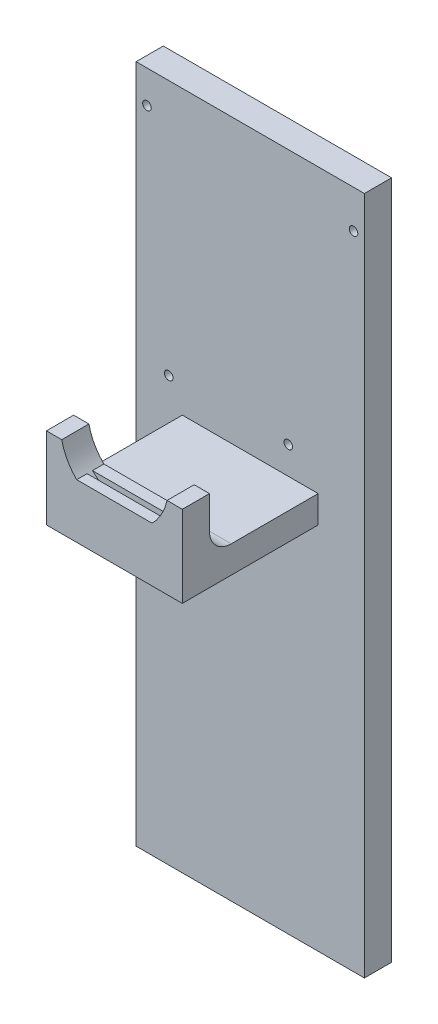
ISO-10303-21;
HEADER;
FILE_DESCRIPTION(('STEP AP214'),'2;1');
FILE_NAME('part.step','',(''),(''),'','','');
FILE_SCHEMA(('AUTOMOTIVE_DESIGN { 1 0 10303 214 1 1 1 1 }'));
ENDSEC;
DATA;
#1=APPLICATION_CONTEXT('core data for automotive mechanical design processes');
#2=APPLICATION_PROTOCOL_DEFINITION('international standard','automotive_design',2000,#1);
#3=PRODUCT_CONTEXT('',#1,'mechanical');
#4=PRODUCT('Part','Part','',(#3));
#5=PRODUCT_RELATED_PRODUCT_CATEGORY('part','',(#4));
#6=PRODUCT_DEFINITION_FORMATION('','',#4);
#7=PRODUCT_DEFINITION_CONTEXT('part definition',#1,'design');
#8=PRODUCT_DEFINITION('design','',#6,#7);
#9=PRODUCT_DEFINITION_SHAPE('','',#8);
#10=(LENGTH_UNIT() NAMED_UNIT(*) SI_UNIT(.MILLI.,.METRE.));
#11=(NAMED_UNIT(*) PLANE_ANGLE_UNIT() SI_UNIT($,.RADIAN.));
#12=(NAMED_UNIT(*) SI_UNIT($,.STERADIAN.) SOLID_ANGLE_UNIT());
#13=UNCERTAINTY_MEASURE_WITH_UNIT(LENGTH_MEASURE(1.E-05),#10,'distance_accuracy_value','');
#14=(GEOMETRIC_REPRESENTATION_CONTEXT(3) GLOBAL_UNCERTAINTY_ASSIGNED_CONTEXT((#13)) GLOBAL_UNIT_ASSIGNED_CONTEXT((#10,
#11,#12)) REPRESENTATION_CONTEXT('',''));
#15=CARTESIAN_POINT('',(0.,0.,0.));
#16=DIRECTION('',(0.,0.,1.));
#17=DIRECTION('',(1.,0.,0.));
#18=AXIS2_PLACEMENT_3D('',#15,#16,#17);
#19=CARTESIAN_POINT('',(0.,75.889063863778,0.));
#20=DIRECTION('',(0.,-1.,0.));
#21=DIRECTION('',(0.,0.,-1.));
#22=AXIS2_PLACEMENT_3D('',#19,#20,#21);
#23=PLANE('',#22);
#24=DIRECTION('',(-1.,0.,0.));
#25=VECTOR('',#24,1.);
#26=CARTESIAN_POINT('',(-32.9664457831326,75.889063863778,31.75));
#27=LINE('',#26,#25);
#28=CARTESIAN_POINT('',(-1.2164457831326,75.889063863778,31.75));
#29=VERTEX_POINT('',#28);
#30=CARTESIAN_POINT('',(-4.7947593866237,75.889063863778,31.75));
#31=VERTEX_POINT('',#30);
#32=EDGE_CURVE('E208',#29,#31,#27,.T.);
#33=ORIENTED_EDGE('',*,*,#32,.T.);
#34=DIRECTION('',(0.,0.,1.));
#35=VECTOR('',#34,1.);
#36=CARTESIAN_POINT('',(-4.7947593866237,75.889063863778,-0.001000000000001));
#37=LINE('',#36,#35);
#38=CARTESIAN_POINT('',(-4.7947593866237,75.889063863778,38.1));
#39=VERTEX_POINT('',#38);
#40=EDGE_CURVE('E376',#39,#31,#37,.F.);
#41=ORIENTED_EDGE('',*,*,#40,.F.);
#42=DIRECTION('',(1.,0.,0.));
#43=VECTOR('',#42,1.);
#44=CARTESIAN_POINT('',(-32.9664457831326,75.889063863778,38.1));
#45=LINE('',#44,#43);
#46=CARTESIAN_POINT('',(-1.2164457831326,75.889063863778,38.1));
#47=VERTEX_POINT('',#46);
#48=EDGE_CURVE('E360',#39,#47,#45,.T.);
#49=ORIENTED_EDGE('',*,*,#48,.T.);
#50=DIRECTION('',(0.,0.,-1.));
#51=VECTOR('',#50,1.);
#52=CARTESIAN_POINT('',(-1.2164457831326,75.889063863778,38.1));
#53=LINE('',#52,#51);
#54=EDGE_CURVE('E364',#47,#29,#53,.T.);
#55=ORIENTED_EDGE('',*,*,#54,.T.);
#56=EDGE_LOOP('',(#33,#41,#49,#55));
#57=FACE_BOUND('',#56,.T.);
#58=ADVANCED_FACE('F39',(#57),#23,.F.);
#59=CARTESIAN_POINT('',(-32.9664457831326,63.189063863778,38.1));
#60=DIRECTION('',(0.,-1.,0.));
#61=DIRECTION('',(0.,0.,-1.));
#62=AXIS2_PLACEMENT_3D('',#59,#60,#61);
#63=PLANE('',#62);
#64=DIRECTION('',(0.,0.,-1.));
#65=VECTOR('',#64,1.);
#66=CARTESIAN_POINT('',(-32.9664457831326,63.189063863778,38.1));
#67=LINE('',#66,#65);
#68=CARTESIAN_POINT('',(-32.9664457831326,63.189063863778,26.67));
#69=VERTEX_POINT('',#68);
#70=CARTESIAN_POINT('',(-32.9664457831326,63.189063863778,6.35));
#71=VERTEX_POINT('',#70);
#72=EDGE_CURVE('E229',#69,#71,#67,.T.);
#73=ORIENTED_EDGE('',*,*,#72,.F.);
#74=DIRECTION('',(-1.,0.,0.));
#75=VECTOR('',#74,1.);
#76=CARTESIAN_POINT('',(-1.2164457831326,63.189063863778,26.67));
#77=LINE('',#76,#75);
#78=CARTESIAN_POINT('',(-1.2164457831326,63.189063863778,26.67));
#79=VERTEX_POINT('',#78);
#80=EDGE_CURVE('E61',#69,#79,#77,.F.);
#81=ORIENTED_EDGE('',*,*,#80,.T.);
#82=DIRECTION('',(0.,0.,-1.));
#83=VECTOR('',#82,1.);
#84=CARTESIAN_POINT('',(-1.2164457831326,63.189063863778,38.1));
#85=LINE('',#84,#83);
#86=CARTESIAN_POINT('',(-1.2164457831326,63.189063863778,6.35));
#87=VERTEX_POINT('',#86);
#88=EDGE_CURVE('E245',#79,#87,#85,.T.);
#89=ORIENTED_EDGE('',*,*,#88,.T.);
#90=DIRECTION('',(-1.,0.,0.));
#91=VECTOR('',#90,1.);
#92=CARTESIAN_POINT('',(-32.9664457831326,63.189063863778,6.35));
#93=LINE('',#92,#91);
#94=EDGE_CURVE('E223',#87,#71,#93,.T.);
#95=ORIENTED_EDGE('',*,*,#94,.T.);
#96=EDGE_LOOP('',(#73,#81,#89,#95));
#97=FACE_BOUND('',#96,.T.);
#98=ADVANCED_FACE('F406',(#97),#63,.F.);
#99=CARTESIAN_POINT('',(0.,0.,6.35));
#100=DIRECTION('',(0.,0.,1.));
#101=DIRECTION('',(1.,0.,0.));
#102=AXIS2_PLACEMENT_3D('',#99,#100,#101);
#103=PLANE('',#102);
#104=CARTESIAN_POINT('',(-41.2214457831326,121.690481927711,6.35));
#105=DIRECTION('',(0.,0.,1.));
#106=DIRECTION('',(1.,0.,0.));
#107=AXIS2_PLACEMENT_3D('',#104,#105,#106);
#108=CIRCLE('',#107,0.999999999999998);
#109=CARTESIAN_POINT('',(-40.2214457831326,121.690481927711,6.35));
#110=VERTEX_POINT('',#109);
#111=EDGE_CURVE('E264',#110,#110,#108,.T.);
#112=ORIENTED_EDGE('',*,*,#111,.F.);
#113=EDGE_LOOP('',(#112));
#114=FACE_BOUND('',#113,.T.);
#115=CARTESIAN_POINT('',(-36.1414457831326,69.6204819277108,6.35));
#116=DIRECTION('',(0.,0.,1.));
#117=DIRECTION('',(1.,0.,0.));
#118=AXIS2_PLACEMENT_3D('',#115,#116,#117);
#119=CIRCLE('',#118,0.999999999999998);
#120=CARTESIAN_POINT('',(-35.1414457831326,69.6204819277108,6.35));
#121=VERTEX_POINT('',#120);
#122=EDGE_CURVE('E280',#121,#121,#119,.T.);
#123=ORIENTED_EDGE('',*,*,#122,.F.);
#124=EDGE_LOOP('',(#123));
#125=FACE_BOUND('',#124,.T.);
#126=DIRECTION('',(0.,-1.,0.));
#127=VECTOR('',#126,1.);
#128=CARTESIAN_POINT('',(-43.7614457831326,129.310481927711,6.35));
#129=LINE('',#128,#127);
#130=CARTESIAN_POINT('',(-43.7614457831326,129.310481927711,6.35));
#131=VERTEX_POINT('',#130);
#132=CARTESIAN_POINT('',(-43.7614457831326,-29.4395180722892,6.35));
#133=VERTEX_POINT('',#132);
#134=EDGE_CURVE('E288',#131,#133,#129,.T.);
#135=ORIENTED_EDGE('',*,*,#134,.T.);
#136=DIRECTION('',(1.,0.,0.));
#137=VECTOR('',#136,1.);
#138=CARTESIAN_POINT('',(-43.7614457831326,-29.4395180722892,6.35));
#139=LINE('',#138,#137);
#140=CARTESIAN_POINT('',(9.57855421686743,-29.4395180722892,6.35));
#141=VERTEX_POINT('',#140);
#142=EDGE_CURVE('E292',#133,#141,#139,.T.);
#143=ORIENTED_EDGE('',*,*,#142,.T.);
#144=DIRECTION('',(0.,1.,0.));
#145=VECTOR('',#144,1.);
#146=CARTESIAN_POINT('',(9.57855421686741,129.310481927711,6.35));
#147=LINE('',#146,#145);
#148=CARTESIAN_POINT('',(9.57855421686741,129.310481927711,6.35));
#149=VERTEX_POINT('',#148);
#150=EDGE_CURVE('E296',#141,#149,#147,.T.);
#151=ORIENTED_EDGE('',*,*,#150,.T.);
#152=DIRECTION('',(-1.,0.,0.));
#153=VECTOR('',#152,1.);
#154=CARTESIAN_POINT('',(-43.7614457831326,129.310481927711,6.35));
#155=LINE('',#154,#153);
#156=EDGE_CURVE('E299',#149,#131,#155,.T.);
#157=ORIENTED_EDGE('',*,*,#156,.T.);
#158=EDGE_LOOP('',(#135,#143,#151,#157));
#159=FACE_BOUND('',#158,.T.);
#160=CARTESIAN_POINT('',(-8.20144578313258,69.6204819277108,6.35));
#161=DIRECTION('',(0.,0.,1.));
#162=DIRECTION('',(1.,0.,0.));
#163=AXIS2_PLACEMENT_3D('',#160,#161,#162);
#164=CIRCLE('',#163,1.);
#165=CARTESIAN_POINT('',(-7.20144578313259,69.6204819277108,6.35));
#166=VERTEX_POINT('',#165);
#167=EDGE_CURVE('E272',#166,#166,#164,.T.);
#168=ORIENTED_EDGE('',*,*,#167,.F.);
#169=EDGE_LOOP('',(#168));
#170=FACE_BOUND('',#169,.T.);
#171=CARTESIAN_POINT('',(7.0385542168674,120.420481927711,6.35));
#172=DIRECTION('',(0.,0.,1.));
#173=DIRECTION('',(1.,0.,0.));
#174=AXIS2_PLACEMENT_3D('',#171,#172,#173);
#175=CIRCLE('',#174,1.);
#176=CARTESIAN_POINT('',(8.0385542168674,120.420481927711,6.35));
#177=VERTEX_POINT('',#176);
#178=EDGE_CURVE('E256',#177,#177,#175,.T.);
#179=ORIENTED_EDGE('',*,*,#178,.F.);
#180=EDGE_LOOP('',(#179));
#181=FACE_BOUND('',#180,.T.);
#182=DIRECTION('',(1.,0.,0.));
#183=VECTOR('',#182,1.);
#184=CARTESIAN_POINT('',(-32.9664457831326,56.839063863778,6.35));
#185=LINE('',#184,#183);
#186=CARTESIAN_POINT('',(-32.9664457831326,56.839063863778,6.35));
#187=VERTEX_POINT('',#186);
#188=CARTESIAN_POINT('',(-1.2164457831326,56.839063863778,6.35));
#189=VERTEX_POINT('',#188);
#190=EDGE_CURVE('E233',#187,#189,#185,.T.);
#191=ORIENTED_EDGE('',*,*,#190,.F.);
#192=DIRECTION('',(0.,-1.,0.));
#193=VECTOR('',#192,1.);
#194=CARTESIAN_POINT('',(-32.9664457831326,63.189063863778,6.35));
#195=LINE('',#194,#193);
#196=EDGE_CURVE('E212',#71,#187,#195,.T.);
#197=ORIENTED_EDGE('',*,*,#196,.F.);
#198=ORIENTED_EDGE('',*,*,#94,.F.);
#199=DIRECTION('',(0.,1.,0.));
#200=VECTOR('',#199,1.);
#201=CARTESIAN_POINT('',(-1.2164457831326,63.189063863778,6.35));
#202=LINE('',#201,#200);
#203=EDGE_CURVE('E236',#189,#87,#202,.T.);
#204=ORIENTED_EDGE('',*,*,#203,.F.);
#205=EDGE_LOOP('',(#191,#197,#198,#204));
#206=FACE_BOUND('',#205,.T.);
#207=ADVANCED_FACE('F411',(#114,#125,#159,#170,#181,#206),#103,.T.);
#208=CARTESIAN_POINT('',(0.,0.,0.));
#209=DIRECTION('',(0.,0.,1.));
#210=DIRECTION('',(1.,0.,0.));
#211=AXIS2_PLACEMENT_3D('',#208,#209,#210);
#212=PLANE('',#211);
#213=DIRECTION('',(0.,-1.,0.));
#214=VECTOR('',#213,1.);
#215=CARTESIAN_POINT('',(-43.7614457831326,129.310481927711,0.));
#216=LINE('',#215,#214);
#217=CARTESIAN_POINT('',(-43.7614457831326,129.310481927711,0.));
#218=VERTEX_POINT('',#217);
#219=CARTESIAN_POINT('',(-43.7614457831326,-29.4395180722892,0.));
#220=VERTEX_POINT('',#219);
#221=EDGE_CURVE('E284',#218,#220,#216,.T.);
#222=ORIENTED_EDGE('',*,*,#221,.F.);
#223=DIRECTION('',(-1.,0.,0.));
#224=VECTOR('',#223,1.);
#225=CARTESIAN_POINT('',(-43.7614457831326,129.310481927711,0.));
#226=LINE('',#225,#224);
#227=CARTESIAN_POINT('',(9.57855421686741,129.310481927711,0.));
#228=VERTEX_POINT('',#227);
#229=EDGE_CURVE('E293',#228,#218,#226,.T.);
#230=ORIENTED_EDGE('',*,*,#229,.F.);
#231=DIRECTION('',(0.,1.,0.));
#232=VECTOR('',#231,1.);
#233=CARTESIAN_POINT('',(9.57855421686741,129.310481927711,0.));
#234=LINE('',#233,#232);
#235=CARTESIAN_POINT('',(9.57855421686743,-29.4395180722892,0.));
#236=VERTEX_POINT('',#235);
#237=EDGE_CURVE('E309',#236,#228,#234,.T.);
#238=ORIENTED_EDGE('',*,*,#237,.F.);
#239=DIRECTION('',(1.,0.,0.));
#240=VECTOR('',#239,1.);
#241=CARTESIAN_POINT('',(-43.7614457831326,-29.4395180722892,0.));
#242=LINE('',#241,#240);
#243=EDGE_CURVE('E306',#220,#236,#242,.T.);
#244=ORIENTED_EDGE('',*,*,#243,.F.);
#245=EDGE_LOOP('',(#222,#230,#238,#244));
#246=FACE_BOUND('',#245,.T.);
#247=CARTESIAN_POINT('',(-36.1414457831326,69.6204819277108,0.));
#248=DIRECTION('',(0.,0.,1.));
#249=DIRECTION('',(1.,0.,0.));
#250=AXIS2_PLACEMENT_3D('',#247,#248,#249);
#251=CIRCLE('',#250,0.999999999999998);
#252=CARTESIAN_POINT('',(-35.1414457831326,69.6204819277108,0.));
#253=VERTEX_POINT('',#252);
#254=EDGE_CURVE('E276',#253,#253,#251,.T.);
#255=ORIENTED_EDGE('',*,*,#254,.T.);
#256=EDGE_LOOP('',(#255));
#257=FACE_BOUND('',#256,.T.);
#258=CARTESIAN_POINT('',(-8.20144578313258,69.6204819277108,0.));
#259=DIRECTION('',(0.,0.,1.));
#260=DIRECTION('',(1.,0.,0.));
#261=AXIS2_PLACEMENT_3D('',#258,#259,#260);
#262=CIRCLE('',#261,1.);
#263=CARTESIAN_POINT('',(-7.20144578313259,69.6204819277108,0.));
#264=VERTEX_POINT('',#263);
#265=EDGE_CURVE('E268',#264,#264,#262,.T.);
#266=ORIENTED_EDGE('',*,*,#265,.T.);
#267=EDGE_LOOP('',(#266));
#268=FACE_BOUND('',#267,.T.);
#269=CARTESIAN_POINT('',(-41.2214457831326,121.690481927711,0.));
#270=DIRECTION('',(0.,0.,1.));
#271=DIRECTION('',(1.,0.,0.));
#272=AXIS2_PLACEMENT_3D('',#269,#270,#271);
#273=CIRCLE('',#272,0.999999999999998);
#274=CARTESIAN_POINT('',(-40.2214457831326,121.690481927711,0.));
#275=VERTEX_POINT('',#274);
#276=EDGE_CURVE('E260',#275,#275,#273,.T.);
#277=ORIENTED_EDGE('',*,*,#276,.T.);
#278=EDGE_LOOP('',(#277));
#279=FACE_BOUND('',#278,.T.);
#280=CARTESIAN_POINT('',(7.0385542168674,120.420481927711,0.));
#281=DIRECTION('',(0.,0.,1.));
#282=DIRECTION('',(1.,0.,0.));
#283=AXIS2_PLACEMENT_3D('',#280,#281,#282);
#284=CIRCLE('',#283,1.);
#285=CARTESIAN_POINT('',(8.0385542168674,120.420481927711,0.));
#286=VERTEX_POINT('',#285);
#287=EDGE_CURVE('E255',#286,#286,#284,.T.);
#288=ORIENTED_EDGE('',*,*,#287,.T.);
#289=EDGE_LOOP('',(#288));
#290=FACE_BOUND('',#289,.T.);
#291=ADVANCED_FACE('F452',(#246,#257,#268,#279,#290),#212,.F.);
#292=CARTESIAN_POINT('',(-43.7614457831326,129.310481927711,6.35));
#293=DIRECTION('',(1.,0.,0.));
#294=DIRECTION('',(0.,1.,0.));
#295=AXIS2_PLACEMENT_3D('',#292,#293,#294);
#296=PLANE('',#295);
#297=ORIENTED_EDGE('',*,*,#221,.T.);
#298=DIRECTION('',(0.,0.,-1.));
#299=VECTOR('',#298,1.);
#300=CARTESIAN_POINT('',(-43.7614457831326,-29.4395180722892,6.35));
#301=LINE('',#300,#299);
#302=EDGE_CURVE('E325',#133,#220,#301,.T.);
#303=ORIENTED_EDGE('',*,*,#302,.F.);
#304=ORIENTED_EDGE('',*,*,#134,.F.);
#305=DIRECTION('',(0.,0.,-1.));
#306=VECTOR('',#305,1.);
#307=CARTESIAN_POINT('',(-43.7614457831326,129.310481927711,6.35));
#308=LINE('',#307,#306);
#309=EDGE_CURVE('E302',#131,#218,#308,.T.);
#310=ORIENTED_EDGE('',*,*,#309,.T.);
#311=EDGE_LOOP('',(#297,#303,#304,#310));
#312=FACE_BOUND('',#311,.T.);
#313=ADVANCED_FACE('F456',(#312),#296,.F.);
#314=CARTESIAN_POINT('',(-43.7614457831326,-29.4395180722892,6.35));
#315=DIRECTION('',(0.,1.,0.));
#316=DIRECTION('',(0.,0.,1.));
#317=AXIS2_PLACEMENT_3D('',#314,#315,#316);
#318=PLANE('',#317);
#319=ORIENTED_EDGE('',*,*,#243,.T.);
#320=DIRECTION('',(0.,0.,-1.));
#321=VECTOR('',#320,1.);
#322=CARTESIAN_POINT('',(9.57855421686743,-29.4395180722892,6.35));
#323=LINE('',#322,#321);
#324=EDGE_CURVE('E321',#141,#236,#323,.T.);
#325=ORIENTED_EDGE('',*,*,#324,.F.);
#326=ORIENTED_EDGE('',*,*,#142,.F.);
#327=ORIENTED_EDGE('',*,*,#302,.T.);
#328=EDGE_LOOP('',(#319,#325,#326,#327));
#329=FACE_BOUND('',#328,.T.);
#330=ADVANCED_FACE('F464',(#329),#318,.F.);
#331=CARTESIAN_POINT('',(9.57855421686741,129.310481927711,6.35));
#332=DIRECTION('',(-1.,0.,0.));
#333=DIRECTION('',(0.,-1.,0.));
#334=AXIS2_PLACEMENT_3D('',#331,#332,#333);
#335=PLANE('',#334);
#336=ORIENTED_EDGE('',*,*,#237,.T.);
#337=DIRECTION('',(0.,0.,-1.));
#338=VECTOR('',#337,1.);
#339=CARTESIAN_POINT('',(9.57855421686741,129.310481927711,6.35));
#340=LINE('',#339,#338);
#341=EDGE_CURVE('E317',#149,#228,#340,.T.);
#342=ORIENTED_EDGE('',*,*,#341,.F.);
#343=ORIENTED_EDGE('',*,*,#150,.F.);
#344=ORIENTED_EDGE('',*,*,#324,.T.);
#345=EDGE_LOOP('',(#336,#342,#343,#344));
#346=FACE_BOUND('',#345,.T.);
#347=ADVANCED_FACE('F460',(#346),#335,.F.);
#348=CARTESIAN_POINT('',(-43.7614457831326,129.310481927711,6.35));
#349=DIRECTION('',(0.,-1.,0.));
#350=DIRECTION('',(0.,0.,-1.));
#351=AXIS2_PLACEMENT_3D('',#348,#349,#350);
#352=PLANE('',#351);
#353=ORIENTED_EDGE('',*,*,#229,.T.);
#354=ORIENTED_EDGE('',*,*,#309,.F.);
#355=ORIENTED_EDGE('',*,*,#156,.F.);
#356=ORIENTED_EDGE('',*,*,#341,.T.);
#357=EDGE_LOOP('',(#353,#354,#355,#356));
#358=FACE_BOUND('',#357,.T.);
#359=ADVANCED_FACE('F448',(#358),#352,.F.);
#360=CARTESIAN_POINT('',(-36.1414457831326,69.6204819277108,6.35));
#361=DIRECTION('',(0.,0.,-1.));
#362=DIRECTION('',(-1.,0.,0.));
#363=AXIS2_PLACEMENT_3D('',#360,#361,#362);
#364=CYLINDRICAL_SURFACE('',#363,0.999999999999998);
#365=ORIENTED_EDGE('',*,*,#122,.T.);
#366=EDGE_LOOP('',(#365));
#367=FACE_BOUND('',#366,.T.);
#368=ORIENTED_EDGE('',*,*,#254,.F.);
#369=EDGE_LOOP('',(#368));
#370=FACE_BOUND('',#369,.T.);
#371=ADVANCED_FACE('F444',(#367,#370),#364,.F.);
#372=CARTESIAN_POINT('',(-8.20144578313258,69.6204819277108,6.35));
#373=DIRECTION('',(0.,0.,-1.));
#374=DIRECTION('',(-1.,0.,0.));
#375=AXIS2_PLACEMENT_3D('',#372,#373,#374);
#376=CYLINDRICAL_SURFACE('',#375,1.);
#377=ORIENTED_EDGE('',*,*,#167,.T.);
#378=EDGE_LOOP('',(#377));
#379=FACE_BOUND('',#378,.T.);
#380=ORIENTED_EDGE('',*,*,#265,.F.);
#381=EDGE_LOOP('',(#380));
#382=FACE_BOUND('',#381,.T.);
#383=ADVANCED_FACE('F440',(#379,#382),#376,.F.);
#384=CARTESIAN_POINT('',(-41.2214457831326,121.690481927711,6.35));
#385=DIRECTION('',(0.,0.,-1.));
#386=DIRECTION('',(-1.,0.,0.));
#387=AXIS2_PLACEMENT_3D('',#384,#385,#386);
#388=CYLINDRICAL_SURFACE('',#387,0.999999999999998);
#389=ORIENTED_EDGE('',*,*,#111,.T.);
#390=EDGE_LOOP('',(#389));
#391=FACE_BOUND('',#390,.T.);
#392=ORIENTED_EDGE('',*,*,#276,.F.);
#393=EDGE_LOOP('',(#392));
#394=FACE_BOUND('',#393,.T.);
#395=ADVANCED_FACE('F436',(#391,#394),#388,.F.);
#396=CARTESIAN_POINT('',(7.0385542168674,120.420481927711,6.35));
#397=DIRECTION('',(0.,0.,-1.));
#398=DIRECTION('',(-1.,0.,0.));
#399=AXIS2_PLACEMENT_3D('',#396,#397,#398);
#400=CYLINDRICAL_SURFACE('',#399,1.);
#401=ORIENTED_EDGE('',*,*,#178,.T.);
#402=EDGE_LOOP('',(#401));
#403=FACE_BOUND('',#402,.T.);
#404=ORIENTED_EDGE('',*,*,#287,.F.);
#405=EDGE_LOOP('',(#404));
#406=FACE_BOUND('',#405,.T.);
#407=ADVANCED_FACE('F433',(#403,#406),#400,.F.);
#408=CARTESIAN_POINT('',(-32.9664457831326,63.189063863778,38.1));
#409=DIRECTION('',(1.,0.,0.));
#410=DIRECTION('',(0.,0.,-1.));
#411=AXIS2_PLACEMENT_3D('',#408,#409,#410);
#412=PLANE('',#411);
#413=DIRECTION('',(0.,0.,-1.));
#414=VECTOR('',#413,1.);
#415=CARTESIAN_POINT('',(-32.9664457831326,56.839063863778,38.1));
#416=LINE('',#415,#414);
#417=CARTESIAN_POINT('',(-32.9664457831326,56.839063863778,38.1));
#418=VERTEX_POINT('',#417);
#419=EDGE_CURVE('E252',#418,#187,#416,.T.);
#420=ORIENTED_EDGE('',*,*,#419,.F.);
#421=DIRECTION('',(0.,-1.,0.));
#422=VECTOR('',#421,1.);
#423=CARTESIAN_POINT('',(-32.9664457831326,63.189063863778,38.1));
#424=LINE('',#423,#422);
#425=CARTESIAN_POINT('',(-32.9664457831326,75.889063863778,38.1));
#426=VERTEX_POINT('',#425);
#427=EDGE_CURVE('E219',#426,#418,#424,.T.);
#428=ORIENTED_EDGE('',*,*,#427,.F.);
#429=DIRECTION('',(0.,0.,1.));
#430=VECTOR('',#429,1.);
#431=CARTESIAN_POINT('',(-32.9664457831326,75.889063863778,38.1));
#432=LINE('',#431,#430);
#433=CARTESIAN_POINT('',(-32.9664457831326,75.889063863778,31.75));
#434=VERTEX_POINT('',#433);
#435=EDGE_CURVE('E206',#434,#426,#432,.T.);
#436=ORIENTED_EDGE('',*,*,#435,.F.);
#437=DIRECTION('',(0.,-1.,0.));
#438=VECTOR('',#437,1.);
#439=CARTESIAN_POINT('',(-32.9664457831326,75.889063863778,31.75));
#440=LINE('',#439,#438);
#441=CARTESIAN_POINT('',(-32.9664457831326,68.269063863778,31.75));
#442=VERTEX_POINT('',#441);
#443=EDGE_CURVE('E196',#434,#442,#440,.T.);
#444=ORIENTED_EDGE('',*,*,#443,.T.);
#445=CARTESIAN_POINT('',(-32.9664457831326,68.269063863778,26.67));
#446=DIRECTION('',(1.,0.,0.));
#447=DIRECTION('',(0.,0.,-1.));
#448=AXIS2_PLACEMENT_3D('',#445,#446,#447);
#449=CIRCLE('',#448,5.08);
#450=EDGE_CURVE('E48',#442,#69,#449,.T.);
#451=ORIENTED_EDGE('',*,*,#450,.T.);
#452=ORIENTED_EDGE('',*,*,#72,.T.);
#453=ORIENTED_EDGE('',*,*,#196,.T.);
#454=EDGE_LOOP('',(#420,#428,#436,#444,#451,#452,#453));
#455=FACE_BOUND('',#454,.T.);
#456=ADVANCED_FACE('F204',(#455),#412,.F.);
#457=CARTESIAN_POINT('',(-32.9664457831326,56.839063863778,38.1));
#458=DIRECTION('',(0.,1.,0.));
#459=DIRECTION('',(-1.,0.,0.));
#460=AXIS2_PLACEMENT_3D('',#457,#458,#459);
#461=PLANE('',#460);
#462=ORIENTED_EDGE('',*,*,#190,.T.);
#463=DIRECTION('',(0.,0.,-1.));
#464=VECTOR('',#463,1.);
#465=CARTESIAN_POINT('',(-1.2164457831326,56.839063863778,38.1));
#466=LINE('',#465,#464);
#467=CARTESIAN_POINT('',(-1.2164457831326,56.839063863778,38.1));
#468=VERTEX_POINT('',#467);
#469=EDGE_CURVE('E248',#468,#189,#466,.T.);
#470=ORIENTED_EDGE('',*,*,#469,.F.);
#471=DIRECTION('',(1.,0.,0.));
#472=VECTOR('',#471,1.);
#473=CARTESIAN_POINT('',(-32.9664457831326,56.839063863778,38.1));
#474=LINE('',#473,#472);
#475=EDGE_CURVE('E222',#418,#468,#474,.T.);
#476=ORIENTED_EDGE('',*,*,#475,.F.);
#477=ORIENTED_EDGE('',*,*,#419,.T.);
#478=EDGE_LOOP('',(#462,#470,#476,#477));
#479=FACE_BOUND('',#478,.T.);
#480=ADVANCED_FACE('F427',(#479),#461,.F.);
#481=CARTESIAN_POINT('',(-1.2164457831326,63.189063863778,38.1));
#482=DIRECTION('',(-1.,0.,0.));
#483=DIRECTION('',(0.,0.,1.));
#484=AXIS2_PLACEMENT_3D('',#481,#482,#483);
#485=PLANE('',#484);
#486=ORIENTED_EDGE('',*,*,#54,.F.);
#487=DIRECTION('',(0.,1.,0.));
#488=VECTOR('',#487,1.);
#489=CARTESIAN_POINT('',(-1.2164457831326,63.189063863778,38.1));
#490=LINE('',#489,#488);
#491=EDGE_CURVE('E226',#468,#47,#490,.T.);
#492=ORIENTED_EDGE('',*,*,#491,.F.);
#493=ORIENTED_EDGE('',*,*,#469,.T.);
#494=ORIENTED_EDGE('',*,*,#203,.T.);
#495=ORIENTED_EDGE('',*,*,#88,.F.);
#496=CARTESIAN_POINT('',(-1.2164457831326,68.269063863778,26.67));
#497=DIRECTION('',(-1.,0.,0.));
#498=DIRECTION('',(0.,0.,1.));
#499=AXIS2_PLACEMENT_3D('',#496,#497,#498);
#500=CIRCLE('',#499,5.08);
#501=CARTESIAN_POINT('',(-1.2164457831326,68.269063863778,31.75));
#502=VERTEX_POINT('',#501);
#503=EDGE_CURVE('E11',#79,#502,#500,.T.);
#504=ORIENTED_EDGE('',*,*,#503,.T.);
#505=DIRECTION('',(0.,-1.,0.));
#506=VECTOR('',#505,1.);
#507=CARTESIAN_POINT('',(-1.2164457831326,75.889063863778,31.75));
#508=LINE('',#507,#506);
#509=EDGE_CURVE('E200',#29,#502,#508,.T.);
#510=ORIENTED_EDGE('',*,*,#509,.F.);
#511=EDGE_LOOP('',(#486,#492,#493,#494,#495,#504,#510));
#512=FACE_BOUND('',#511,.T.);
#513=ADVANCED_FACE('F398',(#512),#485,.F.);
#514=CARTESIAN_POINT('',(0.,0.,38.1));
#515=DIRECTION('',(0.,0.,1.));
#516=DIRECTION('',(1.,0.,0.));
#517=AXIS2_PLACEMENT_3D('',#514,#515,#516);
#518=PLANE('',#517);
#519=ORIENTED_EDGE('',*,*,#427,.T.);
#520=ORIENTED_EDGE('',*,*,#475,.T.);
#521=ORIENTED_EDGE('',*,*,#491,.T.);
#522=ORIENTED_EDGE('',*,*,#48,.F.);
#523=CARTESIAN_POINT('',(-17.0914457831326,78.5104819277108,38.1));
#524=DIRECTION('',(0.,0.,1.));
#525=DIRECTION('',(1.,0.,0.));
#526=AXIS2_PLACEMENT_3D('',#523,#524,#525);
#527=CIRCLE('',#526,12.573);
#528=CARTESIAN_POINT('',(-8.28270087127713,69.539063863778,38.1));
#529=VERTEX_POINT('',#528);
#530=EDGE_CURVE('E354',#529,#39,#527,.T.);
#531=ORIENTED_EDGE('',*,*,#530,.F.);
#532=DIRECTION('',(1.,0.,0.));
#533=VECTOR('',#532,1.);
#534=CARTESIAN_POINT('',(-1.2164457831326,69.539063863778,38.1));
#535=LINE('',#534,#533);
#536=CARTESIAN_POINT('',(-25.900190694988,69.539063863778,38.1));
#537=VERTEX_POINT('',#536);
#538=EDGE_CURVE('E163',#537,#529,#535,.T.);
#539=ORIENTED_EDGE('',*,*,#538,.F.);
#540=CARTESIAN_POINT('',(-29.3881321796415,75.889063863778,38.1));
#541=VERTEX_POINT('',#540);
#542=EDGE_CURVE('E350',#541,#537,#527,.T.);
#543=ORIENTED_EDGE('',*,*,#542,.F.);
#544=EDGE_CURVE('E361',#426,#541,#45,.T.);
#545=ORIENTED_EDGE('',*,*,#544,.F.);
#546=EDGE_LOOP('',(#519,#520,#521,#522,#531,#539,#543,#545));
#547=FACE_BOUND('',#546,.T.);
#548=ADVANCED_FACE('F392',(#547),#518,.T.);
#549=CARTESIAN_POINT('',(-32.9664457831326,75.889063863778,31.75));
#550=DIRECTION('',(0.,0.,1.));
#551=DIRECTION('',(1.,0.,0.));
#552=AXIS2_PLACEMENT_3D('',#549,#550,#551);
#553=PLANE('',#552);
#554=ORIENTED_EDGE('',*,*,#509,.T.);
#555=DIRECTION('',(-1.,0.,0.));
#556=VECTOR('',#555,1.);
#557=CARTESIAN_POINT('',(-32.9664457831326,68.269063863778,31.75));
#558=LINE('',#557,#556);
#559=EDGE_CURVE('E181',#502,#442,#558,.T.);
#560=ORIENTED_EDGE('',*,*,#559,.T.);
#561=ORIENTED_EDGE('',*,*,#443,.F.);
#562=CARTESIAN_POINT('',(-29.3881321796415,75.889063863778,31.75));
#563=VERTEX_POINT('',#562);
#564=EDGE_CURVE('E215',#563,#434,#27,.T.);
#565=ORIENTED_EDGE('',*,*,#564,.F.);
#566=CARTESIAN_POINT('',(-17.0914457831326,78.5104819277108,31.75));
#567=DIRECTION('',(0.,0.,1.));
#568=DIRECTION('',(1.,0.,0.));
#569=AXIS2_PLACEMENT_3D('',#566,#567,#568);
#570=CIRCLE('',#569,12.573);
#571=CARTESIAN_POINT('',(-25.900190694988,69.539063863778,31.75));
#572=VERTEX_POINT('',#571);
#573=EDGE_CURVE('E340',#572,#563,#570,.F.);
#574=ORIENTED_EDGE('',*,*,#573,.F.);
#575=DIRECTION('',(-1.,0.,0.));
#576=VECTOR('',#575,1.);
#577=CARTESIAN_POINT('',(-32.9664457831326,69.539063863778,31.75));
#578=LINE('',#577,#576);
#579=CARTESIAN_POINT('',(-8.28270087127713,69.539063863778,31.75));
#580=VERTEX_POINT('',#579);
#581=EDGE_CURVE('E346',#580,#572,#578,.T.);
#582=ORIENTED_EDGE('',*,*,#581,.F.);
#583=EDGE_CURVE('E349',#31,#580,#570,.F.);
#584=ORIENTED_EDGE('',*,*,#583,.F.);
#585=ORIENTED_EDGE('',*,*,#32,.F.);
#586=EDGE_LOOP('',(#554,#560,#561,#565,#574,#582,#584,#585));
#587=FACE_BOUND('',#586,.T.);
#588=ADVANCED_FACE('F194',(#587),#553,.F.);
#589=ORIENTED_EDGE('',*,*,#544,.T.);
#590=DIRECTION('',(0.,0.,1.));
#591=VECTOR('',#590,1.);
#592=CARTESIAN_POINT('',(-29.3881321796415,75.889063863778,-0.001000000000001));
#593=LINE('',#592,#591);
#594=EDGE_CURVE('E372',#563,#541,#593,.T.);
#595=ORIENTED_EDGE('',*,*,#594,.F.);
#596=ORIENTED_EDGE('',*,*,#564,.T.);
#597=ORIENTED_EDGE('',*,*,#435,.T.);
#598=EDGE_LOOP('',(#589,#595,#596,#597));
#599=FACE_BOUND('',#598,.T.);
#600=ADVANCED_FACE('F371',(#599),#23,.F.);
#601=CARTESIAN_POINT('',(-17.0914457831326,78.5104819277108,-0.001000000000001));
#602=DIRECTION('',(0.,0.,1.));
#603=DIRECTION('',(1.,0.,0.));
#604=AXIS2_PLACEMENT_3D('',#601,#602,#603);
#605=CYLINDRICAL_SURFACE('',#604,12.573);
#606=ORIENTED_EDGE('',*,*,#542,.T.);
#607=DIRECTION('',(0.,0.,1.));
#608=VECTOR('',#607,1.);
#609=CARTESIAN_POINT('',(-25.900190694988,69.539063863778,-0.001000000000001));
#610=LINE('',#609,#608);
#611=CARTESIAN_POINT('',(-25.900190694988,69.539063863778,35.6712390471059));
#612=VERTEX_POINT('',#611);
#613=EDGE_CURVE('E177',#537,#612,#610,.F.);
#614=ORIENTED_EDGE('',*,*,#613,.T.);
#615=CARTESIAN_POINT('',(-17.0914457831326,78.5104819277108,35.6712390471059));
#616=DIRECTION('',(0.,0.,1.));
#617=DIRECTION('',(1.,0.,0.));
#618=AXIS2_PLACEMENT_3D('',#615,#616,#617);
#619=CIRCLE('',#618,12.573);
#620=CARTESIAN_POINT('',(-8.28270087127713,69.539063863778,35.6712390471059));
#621=VERTEX_POINT('',#620);
#622=EDGE_CURVE('E168',#621,#612,#619,.F.);
#623=ORIENTED_EDGE('',*,*,#622,.F.);
#624=DIRECTION('',(0.,0.,1.));
#625=VECTOR('',#624,1.);
#626=CARTESIAN_POINT('',(-8.28270087127713,69.539063863778,-0.001000000000001));
#627=LINE('',#626,#625);
#628=EDGE_CURVE('E157',#621,#529,#627,.T.);
#629=ORIENTED_EDGE('',*,*,#628,.T.);
#630=ORIENTED_EDGE('',*,*,#530,.T.);
#631=ORIENTED_EDGE('',*,*,#40,.T.);
#632=ORIENTED_EDGE('',*,*,#583,.T.);
#633=DIRECTION('',(0.,0.,1.));
#634=VECTOR('',#633,1.);
#635=CARTESIAN_POINT('',(-8.28270087127713,69.539063863778,-0.001000000000001));
#636=LINE('',#635,#634);
#637=CARTESIAN_POINT('',(-8.28270087127713,69.539063863778,34.4212390471059));
#638=VERTEX_POINT('',#637);
#639=EDGE_CURVE('E329',#580,#638,#636,.T.);
#640=ORIENTED_EDGE('',*,*,#639,.T.);
#641=CARTESIAN_POINT('',(-17.0914457831326,78.5104819277108,34.4212390471059));
#642=DIRECTION('',(0.,0.,-1.));
#643=DIRECTION('',(-1.,0.,0.));
#644=AXIS2_PLACEMENT_3D('',#641,#642,#643);
#645=CIRCLE('',#644,12.573);
#646=CARTESIAN_POINT('',(-25.900190694988,69.539063863778,34.4212390471059));
#647=VERTEX_POINT('',#646);
#648=EDGE_CURVE('E333',#647,#638,#645,.F.);
#649=ORIENTED_EDGE('',*,*,#648,.F.);
#650=DIRECTION('',(0.,0.,1.));
#651=VECTOR('',#650,1.);
#652=CARTESIAN_POINT('',(-25.900190694988,69.539063863778,-0.001000000000001));
#653=LINE('',#652,#651);
#654=EDGE_CURVE('E169',#647,#572,#653,.F.);
#655=ORIENTED_EDGE('',*,*,#654,.T.);
#656=ORIENTED_EDGE('',*,*,#573,.T.);
#657=ORIENTED_EDGE('',*,*,#594,.T.);
#658=EDGE_LOOP('',(#606,#614,#623,#629,#630,#631,#632,#640,#649,#655,#656,#657));
#659=FACE_BOUND('',#658,.T.);
#660=ADVANCED_FACE('F176',(#659),#605,.F.);
#661=CARTESIAN_POINT('',(-32.9664457831326,69.539063863778,34.4212390471059));
#662=DIRECTION('',(0.,0.,-1.));
#663=DIRECTION('',(-1.,0.,0.));
#664=AXIS2_PLACEMENT_3D('',#661,#662,#663);
#665=PLANE('',#664);
#666=DIRECTION('',(1.,0.,0.));
#667=VECTOR('',#666,1.);
#668=CARTESIAN_POINT('',(-32.9664457831326,69.539063863778,34.4212390471059));
#669=LINE('',#668,#667);
#670=EDGE_CURVE('E380',#647,#638,#669,.T.);
#671=ORIENTED_EDGE('',*,*,#670,.F.);
#672=ORIENTED_EDGE('',*,*,#648,.T.);
#673=EDGE_LOOP('',(#671,#672));
#674=FACE_BOUND('',#673,.T.);
#675=ADVANCED_FACE('F388',(#674),#665,.F.);
#676=CARTESIAN_POINT('',(0.,69.539063863778,0.));
#677=DIRECTION('',(0.,1.,0.));
#678=DIRECTION('',(0.,0.,1.));
#679=AXIS2_PLACEMENT_3D('',#676,#677,#678);
#680=PLANE('',#679);
#681=ORIENTED_EDGE('',*,*,#654,.F.);
#682=ORIENTED_EDGE('',*,*,#670,.T.);
#683=ORIENTED_EDGE('',*,*,#639,.F.);
#684=ORIENTED_EDGE('',*,*,#581,.T.);
#685=EDGE_LOOP('',(#681,#682,#683,#684));
#686=FACE_BOUND('',#685,.T.);
#687=ADVANCED_FACE('F386',(#686),#680,.T.);
#688=CARTESIAN_POINT('',(-1.2164457831326,69.539063863778,35.6712390471059));
#689=DIRECTION('',(0.,0.,1.));
#690=DIRECTION('',(1.,0.,0.));
#691=AXIS2_PLACEMENT_3D('',#688,#689,#690);
#692=PLANE('',#691);
#693=DIRECTION('',(-1.,0.,0.));
#694=VECTOR('',#693,1.);
#695=CARTESIAN_POINT('',(-1.2164457831326,69.539063863778,35.6712390471059));
#696=LINE('',#695,#694);
#697=EDGE_CURVE('E160',#621,#612,#696,.T.);
#698=ORIENTED_EDGE('',*,*,#697,.F.);
#699=ORIENTED_EDGE('',*,*,#622,.T.);
#700=EDGE_LOOP('',(#698,#699));
#701=FACE_BOUND('',#700,.T.);
#702=ADVANCED_FACE('F172',(#701),#692,.F.);
#703=CARTESIAN_POINT('',(0.,69.539063863778,0.));
#704=DIRECTION('',(0.,1.,0.));
#705=DIRECTION('',(0.,0.,1.));
#706=AXIS2_PLACEMENT_3D('',#703,#704,#705);
#707=PLANE('',#706);
#708=ORIENTED_EDGE('',*,*,#613,.F.);
#709=ORIENTED_EDGE('',*,*,#538,.T.);
#710=ORIENTED_EDGE('',*,*,#628,.F.);
#711=ORIENTED_EDGE('',*,*,#697,.T.);
#712=EDGE_LOOP('',(#708,#709,#710,#711));
#713=FACE_BOUND('',#712,.T.);
#714=ADVANCED_FACE('F159',(#713),#707,.T.);
#715=CARTESIAN_POINT('',(-32.9664457831326,68.269063863778,26.67));
#716=DIRECTION('',(1.,0.,0.));
#717=DIRECTION('',(0.,0.,-1.));
#718=AXIS2_PLACEMENT_3D('',#715,#716,#717);
#719=CYLINDRICAL_SURFACE('',#718,5.08);
#720=ORIENTED_EDGE('',*,*,#503,.F.);
#721=ORIENTED_EDGE('',*,*,#80,.F.);
#722=ORIENTED_EDGE('',*,*,#450,.F.);
#723=ORIENTED_EDGE('',*,*,#559,.F.);
#724=EDGE_LOOP('',(#720,#721,#722,#723));
#725=FACE_BOUND('',#724,.T.);
#726=ADVANCED_FACE('F41',(#725),#719,.F.);
#727=CLOSED_SHELL('',(#58,#98,#207,#291,#313,#330,#347,#359,#371,#383,#395,#407,#456,#480,#513,
#548,#588,#600,#660,#675,#687,#702,#714,#726));
#728=MANIFOLD_SOLID_BREP('B2',#727);
#729=ADVANCED_BREP_SHAPE_REPRESENTATION('',(#18,#728),#14);
#730=SHAPE_DEFINITION_REPRESENTATION(#9,#729);
ENDSEC;
END-ISO-10303-21;
